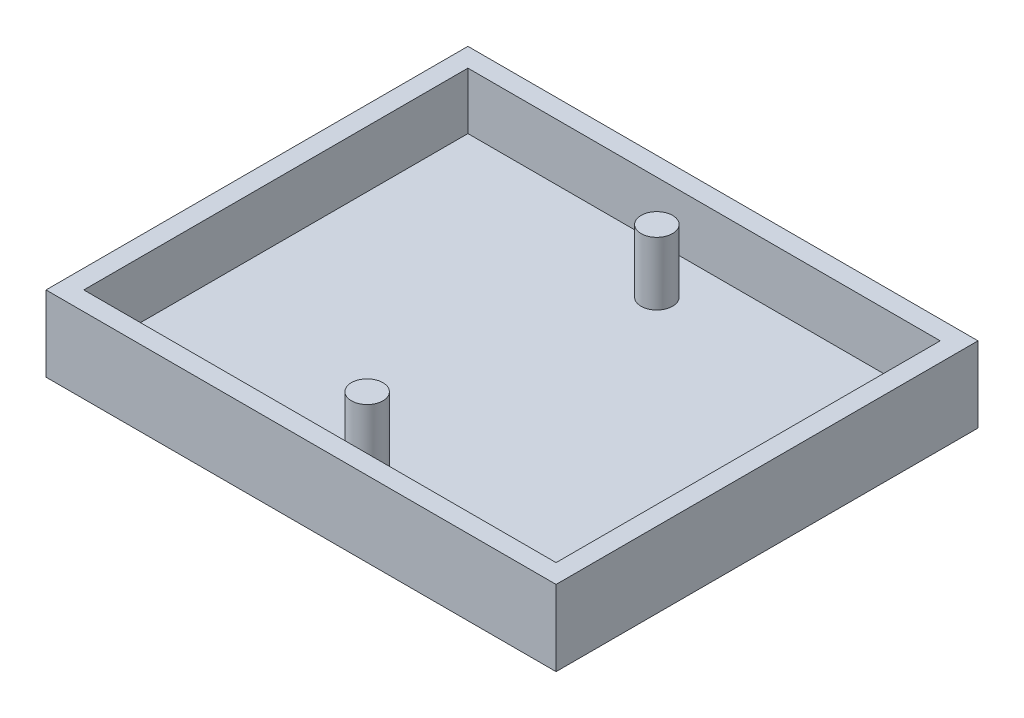
ISO-10303-21;
HEADER;
FILE_DESCRIPTION(('STEP AP214'),'2;1');
FILE_NAME('part.step','',(''),(''),'','','');
FILE_SCHEMA(('AUTOMOTIVE_DESIGN { 1 0 10303 214 1 1 1 1 }'));
ENDSEC;
DATA;
#1=APPLICATION_CONTEXT('core data for automotive mechanical design processes');
#2=APPLICATION_PROTOCOL_DEFINITION('international standard','automotive_design',2000,#1);
#3=PRODUCT_CONTEXT('',#1,'mechanical');
#4=PRODUCT('Part','Part','',(#3));
#5=PRODUCT_RELATED_PRODUCT_CATEGORY('part','',(#4));
#6=PRODUCT_DEFINITION_FORMATION('','',#4);
#7=PRODUCT_DEFINITION_CONTEXT('part definition',#1,'design');
#8=PRODUCT_DEFINITION('design','',#6,#7);
#9=PRODUCT_DEFINITION_SHAPE('','',#8);
#10=(LENGTH_UNIT() NAMED_UNIT(*) SI_UNIT(.MILLI.,.METRE.));
#11=(NAMED_UNIT(*) PLANE_ANGLE_UNIT() SI_UNIT($,.RADIAN.));
#12=(NAMED_UNIT(*) SI_UNIT($,.STERADIAN.) SOLID_ANGLE_UNIT());
#13=UNCERTAINTY_MEASURE_WITH_UNIT(LENGTH_MEASURE(1.E-05),#10,'distance_accuracy_value','');
#14=(GEOMETRIC_REPRESENTATION_CONTEXT(3) GLOBAL_UNCERTAINTY_ASSIGNED_CONTEXT((#13)) GLOBAL_UNIT_ASSIGNED_CONTEXT((#10,
#11,#12)) REPRESENTATION_CONTEXT('',''));
#15=CARTESIAN_POINT('',(0.,0.,0.));
#16=DIRECTION('',(0.,0.,1.));
#17=DIRECTION('',(1.,0.,0.));
#18=AXIS2_PLACEMENT_3D('',#15,#16,#17);
#19=CARTESIAN_POINT('',(0.,4.5,0.));
#20=DIRECTION('',(0.,-1.,0.));
#21=DIRECTION('',(0.,0.,-1.));
#22=AXIS2_PLACEMENT_3D('',#19,#20,#21);
#23=PLANE('',#22);
#24=DIRECTION('',(0.,0.,-1.));
#25=VECTOR('',#24,1.);
#26=CARTESIAN_POINT('',(39.,4.5,1.5));
#27=LINE('',#26,#25);
#28=CARTESIAN_POINT('',(39.,4.5,1.5));
#29=VERTEX_POINT('',#28);
#30=CARTESIAN_POINT('',(39.,4.5,-32.));
#31=VERTEX_POINT('',#30);
#32=EDGE_CURVE('E161',#29,#31,#27,.T.);
#33=ORIENTED_EDGE('',*,*,#32,.T.);
#34=DIRECTION('',(-1.,0.,0.));
#35=VECTOR('',#34,1.);
#36=CARTESIAN_POINT('',(-1.5,4.5,-32.));
#37=LINE('',#36,#35);
#38=CARTESIAN_POINT('',(-1.5,4.5,-32.));
#39=VERTEX_POINT('',#38);
#40=EDGE_CURVE('E164',#31,#39,#37,.T.);
#41=ORIENTED_EDGE('',*,*,#40,.T.);
#42=DIRECTION('',(0.,0.,1.));
#43=VECTOR('',#42,1.);
#44=CARTESIAN_POINT('',(-1.5,4.5,1.5));
#45=LINE('',#44,#43);
#46=CARTESIAN_POINT('',(-1.5,4.5,1.5));
#47=VERTEX_POINT('',#46);
#48=EDGE_CURVE('E109',#39,#47,#45,.T.);
#49=ORIENTED_EDGE('',*,*,#48,.T.);
#50=DIRECTION('',(1.,0.,0.));
#51=VECTOR('',#50,1.);
#52=CARTESIAN_POINT('',(-1.5,4.5,1.5));
#53=LINE('',#52,#51);
#54=EDGE_CURVE('E167',#47,#29,#53,.T.);
#55=ORIENTED_EDGE('',*,*,#54,.T.);
#56=EDGE_LOOP('',(#33,#41,#49,#55));
#57=FACE_BOUND('',#56,.T.);
#58=DIRECTION('',(0.,0.,1.));
#59=VECTOR('',#58,1.);
#60=CARTESIAN_POINT('',(0.,4.5,0.));
#61=LINE('',#60,#59);
#62=CARTESIAN_POINT('',(0.,4.5,-30.5));
#63=VERTEX_POINT('',#62);
#64=CARTESIAN_POINT('',(0.,4.5,0.));
#65=VERTEX_POINT('',#64);
#66=EDGE_CURVE('E136',#63,#65,#61,.T.);
#67=ORIENTED_EDGE('',*,*,#66,.F.);
#68=DIRECTION('',(-1.,0.,0.));
#69=VECTOR('',#68,1.);
#70=CARTESIAN_POINT('',(0.,4.5,-30.5));
#71=LINE('',#70,#69);
#72=CARTESIAN_POINT('',(37.5,4.5,-30.5));
#73=VERTEX_POINT('',#72);
#74=EDGE_CURVE('E143',#73,#63,#71,.T.);
#75=ORIENTED_EDGE('',*,*,#74,.F.);
#76=DIRECTION('',(0.,0.,-1.));
#77=VECTOR('',#76,1.);
#78=CARTESIAN_POINT('',(37.5,4.5,0.));
#79=LINE('',#78,#77);
#80=CARTESIAN_POINT('',(37.5,4.5,0.));
#81=VERTEX_POINT('',#80);
#82=EDGE_CURVE('E141',#81,#73,#79,.T.);
#83=ORIENTED_EDGE('',*,*,#82,.F.);
#84=DIRECTION('',(1.,0.,0.));
#85=VECTOR('',#84,1.);
#86=CARTESIAN_POINT('',(0.,4.5,0.));
#87=LINE('',#86,#85);
#88=EDGE_CURVE('E138',#65,#81,#87,.T.);
#89=ORIENTED_EDGE('',*,*,#88,.F.);
#90=EDGE_LOOP('',(#67,#75,#83,#89));
#91=FACE_BOUND('',#90,.T.);
#92=ADVANCED_FACE('F35',(#57,#91),#23,.F.);
#93=CARTESIAN_POINT('',(39.,4.5,1.5));
#94=DIRECTION('',(-1.,0.,0.));
#95=DIRECTION('',(0.,0.,1.));
#96=AXIS2_PLACEMENT_3D('',#93,#94,#95);
#97=PLANE('',#96);
#98=DIRECTION('',(0.,-1.,0.));
#99=VECTOR('',#98,1.);
#100=CARTESIAN_POINT('',(39.,4.5,1.5));
#101=LINE('',#100,#99);
#102=CARTESIAN_POINT('',(39.,-1.5,1.5));
#103=VERTEX_POINT('',#102);
#104=EDGE_CURVE('E169',#29,#103,#101,.T.);
#105=ORIENTED_EDGE('',*,*,#104,.T.);
#106=DIRECTION('',(0.,0.,1.));
#107=VECTOR('',#106,1.);
#108=CARTESIAN_POINT('',(39.,-1.5,1.5));
#109=LINE('',#108,#107);
#110=CARTESIAN_POINT('',(39.,-1.5,-32.));
#111=VERTEX_POINT('',#110);
#112=EDGE_CURVE('E121',#111,#103,#109,.T.);
#113=ORIENTED_EDGE('',*,*,#112,.F.);
#114=DIRECTION('',(0.,-1.,0.));
#115=VECTOR('',#114,1.);
#116=CARTESIAN_POINT('',(39.,4.5,-32.));
#117=LINE('',#116,#115);
#118=EDGE_CURVE('E111',#31,#111,#117,.T.);
#119=ORIENTED_EDGE('',*,*,#118,.F.);
#120=ORIENTED_EDGE('',*,*,#32,.F.);
#121=EDGE_LOOP('',(#105,#113,#119,#120));
#122=FACE_BOUND('',#121,.T.);
#123=ADVANCED_FACE('F37',(#122),#97,.F.);
#124=CARTESIAN_POINT('',(-1.5,4.5,-32.));
#125=DIRECTION('',(0.,0.,1.));
#126=DIRECTION('',(1.,0.,0.));
#127=AXIS2_PLACEMENT_3D('',#124,#125,#126);
#128=PLANE('',#127);
#129=ORIENTED_EDGE('',*,*,#118,.T.);
#130=DIRECTION('',(1.,0.,0.));
#131=VECTOR('',#130,1.);
#132=CARTESIAN_POINT('',(-1.5,-1.5,-32.));
#133=LINE('',#132,#131);
#134=CARTESIAN_POINT('',(-1.5,-1.5,-32.));
#135=VERTEX_POINT('',#134);
#136=EDGE_CURVE('E115',#135,#111,#133,.T.);
#137=ORIENTED_EDGE('',*,*,#136,.F.);
#138=DIRECTION('',(0.,-1.,0.));
#139=VECTOR('',#138,1.);
#140=CARTESIAN_POINT('',(-1.5,4.5,-32.));
#141=LINE('',#140,#139);
#142=EDGE_CURVE('E103',#39,#135,#141,.T.);
#143=ORIENTED_EDGE('',*,*,#142,.F.);
#144=ORIENTED_EDGE('',*,*,#40,.F.);
#145=EDGE_LOOP('',(#129,#137,#143,#144));
#146=FACE_BOUND('',#145,.T.);
#147=ADVANCED_FACE('F116',(#146),#128,.F.);
#148=CARTESIAN_POINT('',(-1.5,4.5,1.5));
#149=DIRECTION('',(1.,0.,0.));
#150=DIRECTION('',(0.,0.,-1.));
#151=AXIS2_PLACEMENT_3D('',#148,#149,#150);
#152=PLANE('',#151);
#153=ORIENTED_EDGE('',*,*,#142,.T.);
#154=DIRECTION('',(0.,0.,-1.));
#155=VECTOR('',#154,1.);
#156=CARTESIAN_POINT('',(-1.5,-1.5,1.5));
#157=LINE('',#156,#155);
#158=CARTESIAN_POINT('',(-1.5,-1.5,1.5));
#159=VERTEX_POINT('',#158);
#160=EDGE_CURVE('E108',#159,#135,#157,.T.);
#161=ORIENTED_EDGE('',*,*,#160,.F.);
#162=DIRECTION('',(0.,-1.,0.));
#163=VECTOR('',#162,1.);
#164=CARTESIAN_POINT('',(-1.5,4.5,1.5));
#165=LINE('',#164,#163);
#166=EDGE_CURVE('E112',#47,#159,#165,.T.);
#167=ORIENTED_EDGE('',*,*,#166,.F.);
#168=ORIENTED_EDGE('',*,*,#48,.F.);
#169=EDGE_LOOP('',(#153,#161,#167,#168));
#170=FACE_BOUND('',#169,.T.);
#171=ADVANCED_FACE('F105',(#170),#152,.F.);
#172=CARTESIAN_POINT('',(-1.5,4.5,1.5));
#173=DIRECTION('',(0.,0.,-1.));
#174=DIRECTION('',(-1.,0.,0.));
#175=AXIS2_PLACEMENT_3D('',#172,#173,#174);
#176=PLANE('',#175);
#177=ORIENTED_EDGE('',*,*,#166,.T.);
#178=DIRECTION('',(-1.,0.,0.));
#179=VECTOR('',#178,1.);
#180=CARTESIAN_POINT('',(-1.5,-1.5,1.5));
#181=LINE('',#180,#179);
#182=EDGE_CURVE('E126',#103,#159,#181,.T.);
#183=ORIENTED_EDGE('',*,*,#182,.F.);
#184=ORIENTED_EDGE('',*,*,#104,.F.);
#185=ORIENTED_EDGE('',*,*,#54,.F.);
#186=EDGE_LOOP('',(#177,#183,#184,#185));
#187=FACE_BOUND('',#186,.T.);
#188=ADVANCED_FACE('F203',(#187),#176,.F.);
#189=CARTESIAN_POINT('',(0.,4.5,0.));
#190=DIRECTION('',(1.,0.,0.));
#191=DIRECTION('',(0.,0.,-1.));
#192=AXIS2_PLACEMENT_3D('',#189,#190,#191);
#193=PLANE('',#192);
#194=DIRECTION('',(0.,0.,1.));
#195=VECTOR('',#194,1.);
#196=CARTESIAN_POINT('',(0.,0.,0.));
#197=LINE('',#196,#195);
#198=CARTESIAN_POINT('',(0.,0.,-30.5));
#199=VERTEX_POINT('',#198);
#200=CARTESIAN_POINT('',(0.,0.,0.));
#201=VERTEX_POINT('',#200);
#202=EDGE_CURVE('E58',#199,#201,#197,.T.);
#203=ORIENTED_EDGE('',*,*,#202,.F.);
#204=DIRECTION('',(0.,-1.,0.));
#205=VECTOR('',#204,1.);
#206=CARTESIAN_POINT('',(0.,4.5,-30.5));
#207=LINE('',#206,#205);
#208=EDGE_CURVE('E145',#63,#199,#207,.T.);
#209=ORIENTED_EDGE('',*,*,#208,.F.);
#210=ORIENTED_EDGE('',*,*,#66,.T.);
#211=DIRECTION('',(0.,-1.,0.));
#212=VECTOR('',#211,1.);
#213=CARTESIAN_POINT('',(0.,4.5,0.));
#214=LINE('',#213,#212);
#215=EDGE_CURVE('E159',#65,#201,#214,.T.);
#216=ORIENTED_EDGE('',*,*,#215,.T.);
#217=EDGE_LOOP('',(#203,#209,#210,#216));
#218=FACE_BOUND('',#217,.T.);
#219=ADVANCED_FACE('F192',(#218),#193,.T.);
#220=CARTESIAN_POINT('',(0.,4.5,0.));
#221=DIRECTION('',(0.,0.,-1.));
#222=DIRECTION('',(-1.,0.,0.));
#223=AXIS2_PLACEMENT_3D('',#220,#221,#222);
#224=PLANE('',#223);
#225=DIRECTION('',(1.,0.,0.));
#226=VECTOR('',#225,1.);
#227=CARTESIAN_POINT('',(0.,0.,0.));
#228=LINE('',#227,#226);
#229=CARTESIAN_POINT('',(37.5,0.,0.));
#230=VERTEX_POINT('',#229);
#231=EDGE_CURVE('E147',#201,#230,#228,.T.);
#232=ORIENTED_EDGE('',*,*,#231,.F.);
#233=ORIENTED_EDGE('',*,*,#215,.F.);
#234=ORIENTED_EDGE('',*,*,#88,.T.);
#235=DIRECTION('',(0.,-1.,0.));
#236=VECTOR('',#235,1.);
#237=CARTESIAN_POINT('',(37.5,4.5,0.));
#238=LINE('',#237,#236);
#239=EDGE_CURVE('E157',#81,#230,#238,.T.);
#240=ORIENTED_EDGE('',*,*,#239,.T.);
#241=EDGE_LOOP('',(#232,#233,#234,#240));
#242=FACE_BOUND('',#241,.T.);
#243=ADVANCED_FACE('F195',(#242),#224,.T.);
#244=CARTESIAN_POINT('',(37.5,4.5,0.));
#245=DIRECTION('',(-1.,0.,0.));
#246=DIRECTION('',(0.,0.,1.));
#247=AXIS2_PLACEMENT_3D('',#244,#245,#246);
#248=PLANE('',#247);
#249=DIRECTION('',(0.,0.,-1.));
#250=VECTOR('',#249,1.);
#251=CARTESIAN_POINT('',(37.5,0.,0.));
#252=LINE('',#251,#250);
#253=CARTESIAN_POINT('',(37.5,0.,-30.5));
#254=VERTEX_POINT('',#253);
#255=EDGE_CURVE('E150',#230,#254,#252,.T.);
#256=ORIENTED_EDGE('',*,*,#255,.F.);
#257=ORIENTED_EDGE('',*,*,#239,.F.);
#258=ORIENTED_EDGE('',*,*,#82,.T.);
#259=DIRECTION('',(0.,-1.,0.));
#260=VECTOR('',#259,1.);
#261=CARTESIAN_POINT('',(37.5,4.5,-30.5));
#262=LINE('',#261,#260);
#263=EDGE_CURVE('E50',#73,#254,#262,.T.);
#264=ORIENTED_EDGE('',*,*,#263,.T.);
#265=EDGE_LOOP('',(#256,#257,#258,#264));
#266=FACE_BOUND('',#265,.T.);
#267=ADVANCED_FACE('F186',(#266),#248,.T.);
#268=CARTESIAN_POINT('',(0.,4.5,-30.5));
#269=DIRECTION('',(0.,0.,1.));
#270=DIRECTION('',(1.,0.,0.));
#271=AXIS2_PLACEMENT_3D('',#268,#269,#270);
#272=PLANE('',#271);
#273=DIRECTION('',(-1.,0.,0.));
#274=VECTOR('',#273,1.);
#275=CARTESIAN_POINT('',(0.,0.,-30.5));
#276=LINE('',#275,#274);
#277=EDGE_CURVE('E139',#254,#199,#276,.T.);
#278=ORIENTED_EDGE('',*,*,#277,.F.);
#279=ORIENTED_EDGE('',*,*,#263,.F.);
#280=ORIENTED_EDGE('',*,*,#74,.T.);
#281=ORIENTED_EDGE('',*,*,#208,.T.);
#282=EDGE_LOOP('',(#278,#279,#280,#281));
#283=FACE_BOUND('',#282,.T.);
#284=ADVANCED_FACE('F180',(#283),#272,.T.);
#285=CARTESIAN_POINT('',(0.,0.,0.));
#286=DIRECTION('',(0.,-1.,0.));
#287=DIRECTION('',(0.,0.,-1.));
#288=AXIS2_PLACEMENT_3D('',#285,#286,#287);
#289=PLANE('',#288);
#290=CARTESIAN_POINT('',(18.75,0.,-3.75000000000001));
#291=DIRECTION('',(0.,-1.,0.));
#292=DIRECTION('',(0.,0.,-1.));
#293=AXIS2_PLACEMENT_3D('',#290,#291,#292);
#294=CIRCLE('',#293,1.25);
#295=CARTESIAN_POINT('',(18.75,0.,-5.00000000000001));
#296=VERTEX_POINT('',#295);
#297=EDGE_CURVE('E11',#296,#296,#294,.F.);
#298=ORIENTED_EDGE('',*,*,#297,.F.);
#299=EDGE_LOOP('',(#298));
#300=FACE_BOUND('',#299,.T.);
#301=CARTESIAN_POINT('',(18.75,0.,-26.75));
#302=DIRECTION('',(0.,-1.,0.));
#303=DIRECTION('',(0.,0.,-1.));
#304=AXIS2_PLACEMENT_3D('',#301,#302,#303);
#305=CIRCLE('',#304,1.25);
#306=CARTESIAN_POINT('',(18.75,0.,-28.));
#307=VERTEX_POINT('',#306);
#308=EDGE_CURVE('E43',#307,#307,#305,.F.);
#309=ORIENTED_EDGE('',*,*,#308,.F.);
#310=EDGE_LOOP('',(#309));
#311=FACE_BOUND('',#310,.T.);
#312=ORIENTED_EDGE('',*,*,#255,.T.);
#313=ORIENTED_EDGE('',*,*,#277,.T.);
#314=ORIENTED_EDGE('',*,*,#202,.T.);
#315=ORIENTED_EDGE('',*,*,#231,.T.);
#316=EDGE_LOOP('',(#312,#313,#314,#315));
#317=FACE_BOUND('',#316,.T.);
#318=ADVANCED_FACE('F177',(#300,#311,#317),#289,.F.);
#319=CARTESIAN_POINT('',(0.,-1.5,0.));
#320=DIRECTION('',(0.,-1.,0.));
#321=DIRECTION('',(0.,0.,-1.));
#322=AXIS2_PLACEMENT_3D('',#319,#320,#321);
#323=PLANE('',#322);
#324=ORIENTED_EDGE('',*,*,#160,.T.);
#325=ORIENTED_EDGE('',*,*,#136,.T.);
#326=ORIENTED_EDGE('',*,*,#112,.T.);
#327=ORIENTED_EDGE('',*,*,#182,.T.);
#328=EDGE_LOOP('',(#324,#325,#326,#327));
#329=FACE_BOUND('',#328,.T.);
#330=ADVANCED_FACE('F124',(#329),#323,.T.);
#331=CARTESIAN_POINT('',(18.75,5.,-26.75));
#332=DIRECTION('',(0.,-1.,0.));
#333=DIRECTION('',(0.,0.,-1.));
#334=AXIS2_PLACEMENT_3D('',#331,#332,#333);
#335=CYLINDRICAL_SURFACE('',#334,1.25);
#336=CARTESIAN_POINT('',(18.75,5.,-26.75));
#337=DIRECTION('',(0.,1.,0.));
#338=DIRECTION('',(0.,0.,1.));
#339=AXIS2_PLACEMENT_3D('',#336,#337,#338);
#340=CIRCLE('',#339,1.25);
#341=CARTESIAN_POINT('',(18.75,5.,-25.5));
#342=VERTEX_POINT('',#341);
#343=EDGE_CURVE('E127',#342,#342,#340,.T.);
#344=ORIENTED_EDGE('',*,*,#343,.F.);
#345=EDGE_LOOP('',(#344));
#346=FACE_BOUND('',#345,.T.);
#347=ORIENTED_EDGE('',*,*,#308,.T.);
#348=EDGE_LOOP('',(#347));
#349=FACE_BOUND('',#348,.T.);
#350=ADVANCED_FACE('F175',(#346,#349),#335,.T.);
#351=CARTESIAN_POINT('',(18.75,5.,-26.75));
#352=DIRECTION('',(0.,1.,0.));
#353=DIRECTION('',(0.,0.,1.));
#354=AXIS2_PLACEMENT_3D('',#351,#352,#353);
#355=PLANE('',#354);
#356=ORIENTED_EDGE('',*,*,#343,.T.);
#357=EDGE_LOOP('',(#356));
#358=FACE_BOUND('',#357,.T.);
#359=ADVANCED_FACE('F277',(#358),#355,.T.);
#360=CARTESIAN_POINT('',(18.75,5.,-3.75000000000001));
#361=DIRECTION('',(0.,-1.,0.));
#362=DIRECTION('',(0.,0.,-1.));
#363=AXIS2_PLACEMENT_3D('',#360,#361,#362);
#364=CYLINDRICAL_SURFACE('',#363,1.25);
#365=CARTESIAN_POINT('',(18.75,5.,-3.75000000000001));
#366=DIRECTION('',(0.,1.,0.));
#367=DIRECTION('',(0.,0.,1.));
#368=AXIS2_PLACEMENT_3D('',#365,#366,#367);
#369=CIRCLE('',#368,1.25);
#370=CARTESIAN_POINT('',(18.75,5.,-2.50000000000001));
#371=VERTEX_POINT('',#370);
#372=EDGE_CURVE('E130',#371,#371,#369,.T.);
#373=ORIENTED_EDGE('',*,*,#372,.F.);
#374=EDGE_LOOP('',(#373));
#375=FACE_BOUND('',#374,.T.);
#376=ORIENTED_EDGE('',*,*,#297,.T.);
#377=EDGE_LOOP('',(#376));
#378=FACE_BOUND('',#377,.T.);
#379=ADVANCED_FACE('F287',(#375,#378),#364,.T.);
#380=CARTESIAN_POINT('',(18.75,5.,-3.75000000000001));
#381=DIRECTION('',(0.,1.,0.));
#382=DIRECTION('',(0.,0.,1.));
#383=AXIS2_PLACEMENT_3D('',#380,#381,#382);
#384=PLANE('',#383);
#385=ORIENTED_EDGE('',*,*,#372,.T.);
#386=EDGE_LOOP('',(#385));
#387=FACE_BOUND('',#386,.T.);
#388=ADVANCED_FACE('F297',(#387),#384,.T.);
#389=CLOSED_SHELL('',(#92,#123,#147,#171,#188,#219,#243,#267,#284,#318,#330,#350,#359,#379,#388));
#390=MANIFOLD_SOLID_BREP('B2',#389);
#391=ADVANCED_BREP_SHAPE_REPRESENTATION('',(#18,#390),#14);
#392=SHAPE_DEFINITION_REPRESENTATION(#9,#391);
ENDSEC;
END-ISO-10303-21;
